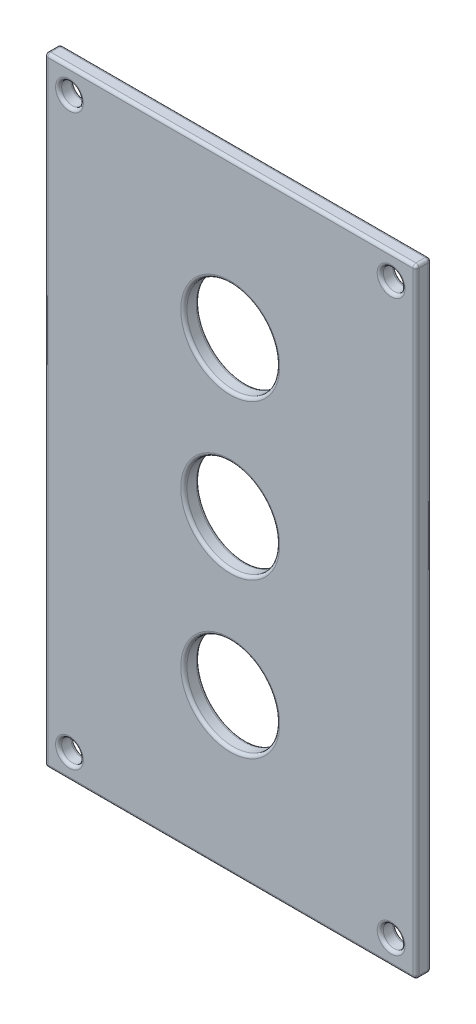
ISO-10303-21;
HEADER;
FILE_DESCRIPTION(('STEP AP214'),'2;1');
FILE_NAME('part.step','',(''),(''),'','','');
FILE_SCHEMA(('AUTOMOTIVE_DESIGN { 1 0 10303 214 1 1 1 1 }'));
ENDSEC;
DATA;
#1=APPLICATION_CONTEXT('core data for automotive mechanical design processes');
#2=APPLICATION_PROTOCOL_DEFINITION('international standard','automotive_design',2000,#1);
#3=PRODUCT_CONTEXT('',#1,'mechanical');
#4=PRODUCT('Part','Part','',(#3));
#5=PRODUCT_RELATED_PRODUCT_CATEGORY('part','',(#4));
#6=PRODUCT_DEFINITION_FORMATION('','',#4);
#7=PRODUCT_DEFINITION_CONTEXT('part definition',#1,'design');
#8=PRODUCT_DEFINITION('design','',#6,#7);
#9=PRODUCT_DEFINITION_SHAPE('','',#8);
#10=(LENGTH_UNIT() NAMED_UNIT(*) SI_UNIT(.MILLI.,.METRE.));
#11=(NAMED_UNIT(*) PLANE_ANGLE_UNIT() SI_UNIT($,.RADIAN.));
#12=(NAMED_UNIT(*) SI_UNIT($,.STERADIAN.) SOLID_ANGLE_UNIT());
#13=UNCERTAINTY_MEASURE_WITH_UNIT(LENGTH_MEASURE(1.E-05),#10,'distance_accuracy_value','');
#14=(GEOMETRIC_REPRESENTATION_CONTEXT(3) GLOBAL_UNCERTAINTY_ASSIGNED_CONTEXT((#13)) GLOBAL_UNIT_ASSIGNED_CONTEXT((#10,
#11,#12)) REPRESENTATION_CONTEXT('',''));
#15=CARTESIAN_POINT('',(0.,0.,0.));
#16=DIRECTION('',(0.,0.,1.));
#17=DIRECTION('',(1.,0.,0.));
#18=AXIS2_PLACEMENT_3D('',#15,#16,#17);
#19=CARTESIAN_POINT('',(0.,0.,2.5));
#20=DIRECTION('',(0.,0.,-1.));
#21=DIRECTION('',(-1.,0.,0.));
#22=AXIS2_PLACEMENT_3D('',#19,#20,#21);
#23=PLANE('',#22);
#24=CARTESIAN_POINT('',(56.,96.,2.5));
#25=DIRECTION('',(0.,0.,-1.));
#26=DIRECTION('',(-1.,0.,0.));
#27=AXIS2_PLACEMENT_3D('',#24,#25,#26);
#28=CIRCLE('',#27,2.25);
#29=CARTESIAN_POINT('',(53.75,96.,2.5));
#30=VERTEX_POINT('',#29);
#31=EDGE_CURVE('E172',#30,#30,#28,.T.);
#32=ORIENTED_EDGE('',*,*,#31,.T.);
#33=EDGE_LOOP('',(#32));
#34=FACE_BOUND('',#33,.T.);
#35=CARTESIAN_POINT('',(56.,4.,2.5));
#36=DIRECTION('',(0.,0.,-1.));
#37=DIRECTION('',(-1.,0.,0.));
#38=AXIS2_PLACEMENT_3D('',#35,#36,#37);
#39=CIRCLE('',#38,2.25);
#40=CARTESIAN_POINT('',(53.75,4.,2.5));
#41=VERTEX_POINT('',#40);
#42=EDGE_CURVE('E169',#41,#41,#39,.T.);
#43=ORIENTED_EDGE('',*,*,#42,.T.);
#44=EDGE_LOOP('',(#43));
#45=FACE_BOUND('',#44,.T.);
#46=CARTESIAN_POINT('',(4.,4.,2.5));
#47=DIRECTION('',(0.,0.,-1.));
#48=DIRECTION('',(-1.,0.,0.));
#49=AXIS2_PLACEMENT_3D('',#46,#47,#48);
#50=CIRCLE('',#49,2.25);
#51=CARTESIAN_POINT('',(1.75,4.,2.5));
#52=VERTEX_POINT('',#51);
#53=EDGE_CURVE('E162',#52,#52,#50,.T.);
#54=ORIENTED_EDGE('',*,*,#53,.T.);
#55=EDGE_LOOP('',(#54));
#56=FACE_BOUND('',#55,.T.);
#57=CARTESIAN_POINT('',(4.,96.,2.5));
#58=DIRECTION('',(0.,0.,-1.));
#59=DIRECTION('',(-1.,0.,0.));
#60=AXIS2_PLACEMENT_3D('',#57,#58,#59);
#61=CIRCLE('',#60,2.25);
#62=CARTESIAN_POINT('',(1.75,96.,2.5));
#63=VERTEX_POINT('',#62);
#64=EDGE_CURVE('E159',#63,#63,#61,.T.);
#65=ORIENTED_EDGE('',*,*,#64,.T.);
#66=EDGE_LOOP('',(#65));
#67=FACE_BOUND('',#66,.T.);
#68=DIRECTION('',(0.,1.,0.));
#69=VECTOR('',#68,1.);
#70=CARTESIAN_POINT('',(59.5,0.,2.5));
#71=LINE('',#70,#69);
#72=CARTESIAN_POINT('',(59.5,0.5,2.5));
#73=VERTEX_POINT('',#72);
#74=CARTESIAN_POINT('',(59.5,99.5,2.5));
#75=VERTEX_POINT('',#74);
#76=EDGE_CURVE('E157',#73,#75,#71,.T.);
#77=ORIENTED_EDGE('',*,*,#76,.T.);
#78=DIRECTION('',(-1.,0.,0.));
#79=VECTOR('',#78,1.);
#80=CARTESIAN_POINT('',(0.,99.5,2.5));
#81=LINE('',#80,#79);
#82=CARTESIAN_POINT('',(0.5,99.5,2.5));
#83=VERTEX_POINT('',#82);
#84=EDGE_CURVE('E128',#75,#83,#81,.T.);
#85=ORIENTED_EDGE('',*,*,#84,.T.);
#86=DIRECTION('',(0.,-1.,0.));
#87=VECTOR('',#86,1.);
#88=CARTESIAN_POINT('',(0.5,0.,2.5));
#89=LINE('',#88,#87);
#90=CARTESIAN_POINT('',(0.5,0.5,2.5));
#91=VERTEX_POINT('',#90);
#92=EDGE_CURVE('E146',#83,#91,#89,.T.);
#93=ORIENTED_EDGE('',*,*,#92,.T.);
#94=DIRECTION('',(1.,0.,0.));
#95=VECTOR('',#94,1.);
#96=CARTESIAN_POINT('',(0.,0.5,2.5));
#97=LINE('',#96,#95);
#98=EDGE_CURVE('E152',#91,#73,#97,.T.);
#99=ORIENTED_EDGE('',*,*,#98,.T.);
#100=EDGE_LOOP('',(#77,#85,#93,#99));
#101=FACE_BOUND('',#100,.T.);
#102=CARTESIAN_POINT('',(30.,50.,2.5));
#103=DIRECTION('',(0.,0.,-1.));
#104=DIRECTION('',(-1.,0.,0.));
#105=AXIS2_PLACEMENT_3D('',#102,#103,#104);
#106=CIRCLE('',#105,8.);
#107=CARTESIAN_POINT('',(22.,50.,2.5));
#108=VERTEX_POINT('',#107);
#109=EDGE_CURVE('E153',#108,#108,#106,.T.);
#110=ORIENTED_EDGE('',*,*,#109,.T.);
#111=EDGE_LOOP('',(#110));
#112=FACE_BOUND('',#111,.T.);
#113=CARTESIAN_POINT('',(30.,75.,2.5));
#114=DIRECTION('',(0.,0.,-1.));
#115=DIRECTION('',(-1.,0.,0.));
#116=AXIS2_PLACEMENT_3D('',#113,#114,#115);
#117=CIRCLE('',#116,8.);
#118=CARTESIAN_POINT('',(22.,75.,2.5));
#119=VERTEX_POINT('',#118);
#120=EDGE_CURVE('E341',#119,#119,#117,.T.);
#121=ORIENTED_EDGE('',*,*,#120,.T.);
#122=EDGE_LOOP('',(#121));
#123=FACE_BOUND('',#122,.T.);
#124=CARTESIAN_POINT('',(30.,25.,2.5));
#125=DIRECTION('',(0.,0.,-1.));
#126=DIRECTION('',(-1.,0.,0.));
#127=AXIS2_PLACEMENT_3D('',#124,#125,#126);
#128=CIRCLE('',#127,8.);
#129=CARTESIAN_POINT('',(22.,25.,2.5));
#130=VERTEX_POINT('',#129);
#131=EDGE_CURVE('E336',#130,#130,#128,.T.);
#132=ORIENTED_EDGE('',*,*,#131,.T.);
#133=EDGE_LOOP('',(#132));
#134=FACE_BOUND('',#133,.T.);
#135=ADVANCED_FACE('F33',(#34,#45,#56,#67,#101,#112,#123,#134),#23,.F.);
#136=CARTESIAN_POINT('',(0.,0.,0.));
#137=DIRECTION('',(0.,0.,-1.));
#138=DIRECTION('',(-1.,0.,0.));
#139=AXIS2_PLACEMENT_3D('',#136,#137,#138);
#140=PLANE('',#139);
#141=CARTESIAN_POINT('',(56.,96.,0.));
#142=DIRECTION('',(0.,0.,-1.));
#143=DIRECTION('',(-1.,0.,0.));
#144=AXIS2_PLACEMENT_3D('',#141,#142,#143);
#145=CIRCLE('',#144,2.25);
#146=CARTESIAN_POINT('',(53.75,96.,0.));
#147=VERTEX_POINT('',#146);
#148=EDGE_CURVE('E11',#147,#147,#145,.F.);
#149=ORIENTED_EDGE('',*,*,#148,.T.);
#150=EDGE_LOOP('',(#149));
#151=FACE_BOUND('',#150,.T.);
#152=CARTESIAN_POINT('',(4.,4.,0.));
#153=DIRECTION('',(0.,0.,-1.));
#154=DIRECTION('',(-1.,0.,0.));
#155=AXIS2_PLACEMENT_3D('',#152,#153,#154);
#156=CIRCLE('',#155,2.25);
#157=CARTESIAN_POINT('',(1.75,4.,0.));
#158=VERTEX_POINT('',#157);
#159=EDGE_CURVE('E42',#158,#158,#156,.F.);
#160=ORIENTED_EDGE('',*,*,#159,.T.);
#161=EDGE_LOOP('',(#160));
#162=FACE_BOUND('',#161,.T.);
#163=DIRECTION('',(0.,1.,0.));
#164=VECTOR('',#163,1.);
#165=CARTESIAN_POINT('',(59.5,0.,0.));
#166=LINE('',#165,#164);
#167=CARTESIAN_POINT('',(59.5,99.5,0.));
#168=VERTEX_POINT('',#167);
#169=CARTESIAN_POINT('',(59.5,0.5,0.));
#170=VERTEX_POINT('',#169);
#171=EDGE_CURVE('E50',#168,#170,#166,.F.);
#172=ORIENTED_EDGE('',*,*,#171,.T.);
#173=DIRECTION('',(1.,0.,0.));
#174=VECTOR('',#173,1.);
#175=CARTESIAN_POINT('',(0.,0.5,0.));
#176=LINE('',#175,#174);
#177=CARTESIAN_POINT('',(0.5,0.5,0.));
#178=VERTEX_POINT('',#177);
#179=EDGE_CURVE('E264',#170,#178,#176,.F.);
#180=ORIENTED_EDGE('',*,*,#179,.T.);
#181=DIRECTION('',(0.,-1.,0.));
#182=VECTOR('',#181,1.);
#183=CARTESIAN_POINT('',(0.5,100.,0.));
#184=LINE('',#183,#182);
#185=CARTESIAN_POINT('',(0.5,99.5,0.));
#186=VERTEX_POINT('',#185);
#187=EDGE_CURVE('E260',#178,#186,#184,.F.);
#188=ORIENTED_EDGE('',*,*,#187,.T.);
#189=DIRECTION('',(-1.,0.,0.));
#190=VECTOR('',#189,1.);
#191=CARTESIAN_POINT('',(60.,99.5,0.));
#192=LINE('',#191,#190);
#193=EDGE_CURVE('E55',#186,#168,#192,.F.);
#194=ORIENTED_EDGE('',*,*,#193,.T.);
#195=EDGE_LOOP('',(#172,#180,#188,#194));
#196=FACE_BOUND('',#195,.T.);
#197=CARTESIAN_POINT('',(4.,96.,0.));
#198=DIRECTION('',(0.,0.,-1.));
#199=DIRECTION('',(-1.,0.,0.));
#200=AXIS2_PLACEMENT_3D('',#197,#198,#199);
#201=CIRCLE('',#200,2.25);
#202=CARTESIAN_POINT('',(1.75,96.,0.));
#203=VERTEX_POINT('',#202);
#204=EDGE_CURVE('E257',#203,#203,#201,.F.);
#205=ORIENTED_EDGE('',*,*,#204,.T.);
#206=EDGE_LOOP('',(#205));
#207=FACE_BOUND('',#206,.T.);
#208=CARTESIAN_POINT('',(56.,4.,0.));
#209=DIRECTION('',(0.,0.,-1.));
#210=DIRECTION('',(-1.,0.,0.));
#211=AXIS2_PLACEMENT_3D('',#208,#209,#210);
#212=CIRCLE('',#211,2.25);
#213=CARTESIAN_POINT('',(53.75,4.,0.));
#214=VERTEX_POINT('',#213);
#215=EDGE_CURVE('E254',#214,#214,#212,.F.);
#216=ORIENTED_EDGE('',*,*,#215,.T.);
#217=EDGE_LOOP('',(#216));
#218=FACE_BOUND('',#217,.T.);
#219=CARTESIAN_POINT('',(30.,50.,0.));
#220=DIRECTION('',(0.,0.,-1.));
#221=DIRECTION('',(-1.,0.,0.));
#222=AXIS2_PLACEMENT_3D('',#219,#220,#221);
#223=CIRCLE('',#222,8.);
#224=CARTESIAN_POINT('',(22.,50.,0.));
#225=VERTEX_POINT('',#224);
#226=EDGE_CURVE('E251',#225,#225,#223,.F.);
#227=ORIENTED_EDGE('',*,*,#226,.T.);
#228=EDGE_LOOP('',(#227));
#229=FACE_BOUND('',#228,.T.);
#230=CARTESIAN_POINT('',(30.,75.,0.));
#231=DIRECTION('',(0.,0.,-1.));
#232=DIRECTION('',(-1.,0.,0.));
#233=AXIS2_PLACEMENT_3D('',#230,#231,#232);
#234=CIRCLE('',#233,8.);
#235=CARTESIAN_POINT('',(22.,75.,0.));
#236=VERTEX_POINT('',#235);
#237=EDGE_CURVE('E248',#236,#236,#234,.F.);
#238=ORIENTED_EDGE('',*,*,#237,.T.);
#239=EDGE_LOOP('',(#238));
#240=FACE_BOUND('',#239,.T.);
#241=CARTESIAN_POINT('',(30.,25.,0.));
#242=DIRECTION('',(0.,0.,-1.));
#243=DIRECTION('',(-1.,0.,0.));
#244=AXIS2_PLACEMENT_3D('',#241,#242,#243);
#245=CIRCLE('',#244,8.);
#246=CARTESIAN_POINT('',(22.,25.,0.));
#247=VERTEX_POINT('',#246);
#248=EDGE_CURVE('E245',#247,#247,#245,.F.);
#249=ORIENTED_EDGE('',*,*,#248,.T.);
#250=EDGE_LOOP('',(#249));
#251=FACE_BOUND('',#250,.T.);
#252=ADVANCED_FACE('F397',(#151,#162,#196,#207,#218,#229,#240,#251),#140,.T.);
#253=CARTESIAN_POINT('',(0.,0.,2.5));
#254=DIRECTION('',(1.,0.,0.));
#255=DIRECTION('',(0.,0.,-1.));
#256=AXIS2_PLACEMENT_3D('',#253,#254,#255);
#257=PLANE('',#256);
#258=DIRECTION('',(0.,-1.,0.));
#259=VECTOR('',#258,1.);
#260=CARTESIAN_POINT('',(0.,0.,2.));
#261=LINE('',#260,#259);
#262=CARTESIAN_POINT('',(0.,0.5,2.));
#263=VERTEX_POINT('',#262);
#264=CARTESIAN_POINT('',(0.,99.5,2.));
#265=VERTEX_POINT('',#264);
#266=EDGE_CURVE('E222',#263,#265,#261,.F.);
#267=ORIENTED_EDGE('',*,*,#266,.T.);
#268=DIRECTION('',(0.,0.,-1.));
#269=VECTOR('',#268,1.);
#270=CARTESIAN_POINT('',(0.,99.5,2.5));
#271=LINE('',#270,#269);
#272=CARTESIAN_POINT('',(0.,99.5,0.5));
#273=VERTEX_POINT('',#272);
#274=EDGE_CURVE('E225',#265,#273,#271,.T.);
#275=ORIENTED_EDGE('',*,*,#274,.T.);
#276=DIRECTION('',(0.,-1.,0.));
#277=VECTOR('',#276,1.);
#278=CARTESIAN_POINT('',(0.,0.,0.5));
#279=LINE('',#278,#277);
#280=CARTESIAN_POINT('',(0.,0.5,0.5));
#281=VERTEX_POINT('',#280);
#282=EDGE_CURVE('E220',#273,#281,#279,.T.);
#283=ORIENTED_EDGE('',*,*,#282,.T.);
#284=DIRECTION('',(0.,0.,-1.));
#285=VECTOR('',#284,1.);
#286=CARTESIAN_POINT('',(0.,0.5,2.5));
#287=LINE('',#286,#285);
#288=EDGE_CURVE('E218',#281,#263,#287,.F.);
#289=ORIENTED_EDGE('',*,*,#288,.T.);
#290=EDGE_LOOP('',(#267,#275,#283,#289));
#291=FACE_BOUND('',#290,.T.);
#292=ADVANCED_FACE('F377',(#291),#257,.F.);
#293=CARTESIAN_POINT('',(0.,0.,2.5));
#294=DIRECTION('',(0.,1.,0.));
#295=DIRECTION('',(0.,0.,1.));
#296=AXIS2_PLACEMENT_3D('',#293,#294,#295);
#297=PLANE('',#296);
#298=DIRECTION('',(1.,0.,0.));
#299=VECTOR('',#298,1.);
#300=CARTESIAN_POINT('',(0.,0.,2.));
#301=LINE('',#300,#299);
#302=CARTESIAN_POINT('',(59.5,0.,2.));
#303=VERTEX_POINT('',#302);
#304=CARTESIAN_POINT('',(0.5,0.,2.));
#305=VERTEX_POINT('',#304);
#306=EDGE_CURVE('E213',#303,#305,#301,.F.);
#307=ORIENTED_EDGE('',*,*,#306,.T.);
#308=DIRECTION('',(0.,0.,-1.));
#309=VECTOR('',#308,1.);
#310=CARTESIAN_POINT('',(0.5,0.,2.5));
#311=LINE('',#310,#309);
#312=CARTESIAN_POINT('',(0.5,0.,0.5));
#313=VERTEX_POINT('',#312);
#314=EDGE_CURVE('E216',#305,#313,#311,.T.);
#315=ORIENTED_EDGE('',*,*,#314,.T.);
#316=DIRECTION('',(1.,0.,0.));
#317=VECTOR('',#316,1.);
#318=CARTESIAN_POINT('',(60.,0.,0.5));
#319=LINE('',#318,#317);
#320=CARTESIAN_POINT('',(59.5,0.,0.5));
#321=VERTEX_POINT('',#320);
#322=EDGE_CURVE('E211',#313,#321,#319,.T.);
#323=ORIENTED_EDGE('',*,*,#322,.T.);
#324=DIRECTION('',(0.,0.,-1.));
#325=VECTOR('',#324,1.);
#326=CARTESIAN_POINT('',(59.5,0.,2.5));
#327=LINE('',#326,#325);
#328=EDGE_CURVE('E209',#321,#303,#327,.F.);
#329=ORIENTED_EDGE('',*,*,#328,.T.);
#330=EDGE_LOOP('',(#307,#315,#323,#329));
#331=FACE_BOUND('',#330,.T.);
#332=ADVANCED_FACE('F415',(#331),#297,.F.);
#333=CARTESIAN_POINT('',(60.,0.,2.5));
#334=DIRECTION('',(-1.,0.,0.));
#335=DIRECTION('',(0.,0.,1.));
#336=AXIS2_PLACEMENT_3D('',#333,#334,#335);
#337=PLANE('',#336);
#338=DIRECTION('',(0.,1.,0.));
#339=VECTOR('',#338,1.);
#340=CARTESIAN_POINT('',(60.,100.,0.5));
#341=LINE('',#340,#339);
#342=CARTESIAN_POINT('',(60.,0.5,0.5));
#343=VERTEX_POINT('',#342);
#344=CARTESIAN_POINT('',(60.,99.5,0.5));
#345=VERTEX_POINT('',#344);
#346=EDGE_CURVE('E202',#343,#345,#341,.T.);
#347=ORIENTED_EDGE('',*,*,#346,.T.);
#348=DIRECTION('',(0.,0.,-1.));
#349=VECTOR('',#348,1.);
#350=CARTESIAN_POINT('',(60.,99.5,2.5));
#351=LINE('',#350,#349);
#352=CARTESIAN_POINT('',(60.,99.5,2.));
#353=VERTEX_POINT('',#352);
#354=EDGE_CURVE('E207',#345,#353,#351,.F.);
#355=ORIENTED_EDGE('',*,*,#354,.T.);
#356=DIRECTION('',(0.,1.,0.));
#357=VECTOR('',#356,1.);
#358=CARTESIAN_POINT('',(60.,0.,2.));
#359=LINE('',#358,#357);
#360=CARTESIAN_POINT('',(60.,0.5,2.));
#361=VERTEX_POINT('',#360);
#362=EDGE_CURVE('E204',#353,#361,#359,.F.);
#363=ORIENTED_EDGE('',*,*,#362,.T.);
#364=DIRECTION('',(0.,0.,-1.));
#365=VECTOR('',#364,1.);
#366=CARTESIAN_POINT('',(60.,0.5,2.5));
#367=LINE('',#366,#365);
#368=EDGE_CURVE('E200',#361,#343,#367,.T.);
#369=ORIENTED_EDGE('',*,*,#368,.T.);
#370=EDGE_LOOP('',(#347,#355,#363,#369));
#371=FACE_BOUND('',#370,.T.);
#372=ADVANCED_FACE('F412',(#371),#337,.F.);
#373=CARTESIAN_POINT('',(0.,100.,2.5));
#374=DIRECTION('',(0.,-1.,0.));
#375=DIRECTION('',(0.,0.,-1.));
#376=AXIS2_PLACEMENT_3D('',#373,#374,#375);
#377=PLANE('',#376);
#378=DIRECTION('',(-1.,0.,0.));
#379=VECTOR('',#378,1.);
#380=CARTESIAN_POINT('',(0.,100.,2.));
#381=LINE('',#380,#379);
#382=CARTESIAN_POINT('',(0.5,100.,2.));
#383=VERTEX_POINT('',#382);
#384=CARTESIAN_POINT('',(59.5,100.,2.));
#385=VERTEX_POINT('',#384);
#386=EDGE_CURVE('E130',#383,#385,#381,.F.);
#387=ORIENTED_EDGE('',*,*,#386,.T.);
#388=DIRECTION('',(0.,0.,-1.));
#389=VECTOR('',#388,1.);
#390=CARTESIAN_POINT('',(59.5,100.,2.5));
#391=LINE('',#390,#389);
#392=CARTESIAN_POINT('',(59.5,100.,0.5));
#393=VERTEX_POINT('',#392);
#394=EDGE_CURVE('E198',#385,#393,#391,.T.);
#395=ORIENTED_EDGE('',*,*,#394,.T.);
#396=DIRECTION('',(-1.,0.,0.));
#397=VECTOR('',#396,1.);
#398=CARTESIAN_POINT('',(0.,100.,0.5));
#399=LINE('',#398,#397);
#400=CARTESIAN_POINT('',(0.5,100.,0.5));
#401=VERTEX_POINT('',#400);
#402=EDGE_CURVE('E195',#393,#401,#399,.T.);
#403=ORIENTED_EDGE('',*,*,#402,.T.);
#404=DIRECTION('',(0.,0.,-1.));
#405=VECTOR('',#404,1.);
#406=CARTESIAN_POINT('',(0.5,100.,2.5));
#407=LINE('',#406,#405);
#408=EDGE_CURVE('E193',#401,#383,#407,.F.);
#409=ORIENTED_EDGE('',*,*,#408,.T.);
#410=EDGE_LOOP('',(#387,#395,#403,#409));
#411=FACE_BOUND('',#410,.T.);
#412=ADVANCED_FACE('F369',(#411),#377,.F.);
#413=CARTESIAN_POINT('',(4.,96.,2.5));
#414=DIRECTION('',(0.,0.,-1.));
#415=DIRECTION('',(-1.,0.,0.));
#416=AXIS2_PLACEMENT_3D('',#413,#414,#415);
#417=CYLINDRICAL_SURFACE('',#416,1.75);
#418=CARTESIAN_POINT('',(4.,96.,2.));
#419=DIRECTION('',(0.,0.,-1.));
#420=DIRECTION('',(-1.,0.,0.));
#421=AXIS2_PLACEMENT_3D('',#418,#419,#420);
#422=CIRCLE('',#421,1.75);
#423=CARTESIAN_POINT('',(2.25,96.,2.));
#424=VERTEX_POINT('',#423);
#425=EDGE_CURVE('E190',#424,#424,#422,.F.);
#426=ORIENTED_EDGE('',*,*,#425,.T.);
#427=EDGE_LOOP('',(#426));
#428=FACE_BOUND('',#427,.T.);
#429=CARTESIAN_POINT('',(4.,96.,0.5));
#430=DIRECTION('',(0.,0.,-1.));
#431=DIRECTION('',(-1.,0.,0.));
#432=AXIS2_PLACEMENT_3D('',#429,#430,#431);
#433=CIRCLE('',#432,1.75);
#434=CARTESIAN_POINT('',(2.25,96.,0.5));
#435=VERTEX_POINT('',#434);
#436=EDGE_CURVE('E187',#435,#435,#433,.T.);
#437=ORIENTED_EDGE('',*,*,#436,.T.);
#438=EDGE_LOOP('',(#437));
#439=FACE_BOUND('',#438,.T.);
#440=ADVANCED_FACE('F407',(#428,#439),#417,.F.);
#441=CARTESIAN_POINT('',(4.,4.,2.5));
#442=DIRECTION('',(0.,0.,-1.));
#443=DIRECTION('',(-1.,0.,0.));
#444=AXIS2_PLACEMENT_3D('',#441,#442,#443);
#445=CYLINDRICAL_SURFACE('',#444,1.75);
#446=CARTESIAN_POINT('',(4.,4.,2.));
#447=DIRECTION('',(0.,0.,-1.));
#448=DIRECTION('',(-1.,0.,0.));
#449=AXIS2_PLACEMENT_3D('',#446,#447,#448);
#450=CIRCLE('',#449,1.75);
#451=CARTESIAN_POINT('',(2.25,4.,2.));
#452=VERTEX_POINT('',#451);
#453=EDGE_CURVE('E184',#452,#452,#450,.F.);
#454=ORIENTED_EDGE('',*,*,#453,.T.);
#455=EDGE_LOOP('',(#454));
#456=FACE_BOUND('',#455,.T.);
#457=CARTESIAN_POINT('',(4.,4.,0.5));
#458=DIRECTION('',(0.,0.,-1.));
#459=DIRECTION('',(-1.,0.,0.));
#460=AXIS2_PLACEMENT_3D('',#457,#458,#459);
#461=CIRCLE('',#460,1.75);
#462=CARTESIAN_POINT('',(2.25,4.,0.5));
#463=VERTEX_POINT('',#462);
#464=EDGE_CURVE('E181',#463,#463,#461,.T.);
#465=ORIENTED_EDGE('',*,*,#464,.T.);
#466=EDGE_LOOP('',(#465));
#467=FACE_BOUND('',#466,.T.);
#468=ADVANCED_FACE('F751',(#456,#467),#445,.F.);
#469=CARTESIAN_POINT('',(56.,4.,2.5));
#470=DIRECTION('',(0.,0.,-1.));
#471=DIRECTION('',(-1.,0.,0.));
#472=AXIS2_PLACEMENT_3D('',#469,#470,#471);
#473=CYLINDRICAL_SURFACE('',#472,1.75);
#474=CARTESIAN_POINT('',(56.,4.,2.));
#475=DIRECTION('',(0.,0.,-1.));
#476=DIRECTION('',(-1.,0.,0.));
#477=AXIS2_PLACEMENT_3D('',#474,#475,#476);
#478=CIRCLE('',#477,1.75);
#479=CARTESIAN_POINT('',(54.25,4.,2.));
#480=VERTEX_POINT('',#479);
#481=EDGE_CURVE('E178',#480,#480,#478,.F.);
#482=ORIENTED_EDGE('',*,*,#481,.T.);
#483=EDGE_LOOP('',(#482));
#484=FACE_BOUND('',#483,.T.);
#485=CARTESIAN_POINT('',(56.,4.,0.5));
#486=DIRECTION('',(0.,0.,-1.));
#487=DIRECTION('',(-1.,0.,0.));
#488=AXIS2_PLACEMENT_3D('',#485,#486,#487);
#489=CIRCLE('',#488,1.75);
#490=CARTESIAN_POINT('',(54.25,4.,0.5));
#491=VERTEX_POINT('',#490);
#492=EDGE_CURVE('E175',#491,#491,#489,.T.);
#493=ORIENTED_EDGE('',*,*,#492,.T.);
#494=EDGE_LOOP('',(#493));
#495=FACE_BOUND('',#494,.T.);
#496=ADVANCED_FACE('F742',(#484,#495),#473,.F.);
#497=CARTESIAN_POINT('',(56.,96.,2.5));
#498=DIRECTION('',(0.,0.,-1.));
#499=DIRECTION('',(-1.,0.,0.));
#500=AXIS2_PLACEMENT_3D('',#497,#498,#499);
#501=CYLINDRICAL_SURFACE('',#500,1.75);
#502=CARTESIAN_POINT('',(56.,96.,2.));
#503=DIRECTION('',(0.,0.,-1.));
#504=DIRECTION('',(-1.,0.,0.));
#505=AXIS2_PLACEMENT_3D('',#502,#503,#504);
#506=CIRCLE('',#505,1.75);
#507=CARTESIAN_POINT('',(54.25,96.,2.));
#508=VERTEX_POINT('',#507);
#509=EDGE_CURVE('E331',#508,#508,#506,.F.);
#510=ORIENTED_EDGE('',*,*,#509,.T.);
#511=EDGE_LOOP('',(#510));
#512=FACE_BOUND('',#511,.T.);
#513=CARTESIAN_POINT('',(56.,96.,0.5));
#514=DIRECTION('',(0.,0.,-1.));
#515=DIRECTION('',(-1.,0.,0.));
#516=AXIS2_PLACEMENT_3D('',#513,#514,#515);
#517=CIRCLE('',#516,1.75);
#518=CARTESIAN_POINT('',(54.25,96.,0.5));
#519=VERTEX_POINT('',#518);
#520=EDGE_CURVE('E325',#519,#519,#517,.T.);
#521=ORIENTED_EDGE('',*,*,#520,.T.);
#522=EDGE_LOOP('',(#521));
#523=FACE_BOUND('',#522,.T.);
#524=ADVANCED_FACE('F733',(#512,#523),#501,.F.);
#525=CARTESIAN_POINT('',(30.,50.,-0.00100000000000013));
#526=DIRECTION('',(0.,0.,1.));
#527=DIRECTION('',(1.,0.,0.));
#528=AXIS2_PLACEMENT_3D('',#525,#526,#527);
#529=CYLINDRICAL_SURFACE('',#528,7.5);
#530=CARTESIAN_POINT('',(30.,50.,2.));
#531=DIRECTION('',(0.,0.,-1.));
#532=DIRECTION('',(-1.,0.,0.));
#533=AXIS2_PLACEMENT_3D('',#530,#531,#532);
#534=CIRCLE('',#533,7.5);
#535=CARTESIAN_POINT('',(22.5,50.,2.));
#536=VERTEX_POINT('',#535);
#537=EDGE_CURVE('E230',#536,#536,#534,.F.);
#538=ORIENTED_EDGE('',*,*,#537,.T.);
#539=EDGE_LOOP('',(#538));
#540=FACE_BOUND('',#539,.T.);
#541=CARTESIAN_POINT('',(30.,50.,0.5));
#542=DIRECTION('',(0.,0.,-1.));
#543=DIRECTION('',(-1.,0.,0.));
#544=AXIS2_PLACEMENT_3D('',#541,#542,#543);
#545=CIRCLE('',#544,7.5);
#546=CARTESIAN_POINT('',(22.5,50.,0.5));
#547=VERTEX_POINT('',#546);
#548=EDGE_CURVE('E227',#547,#547,#545,.T.);
#549=ORIENTED_EDGE('',*,*,#548,.T.);
#550=EDGE_LOOP('',(#549));
#551=FACE_BOUND('',#550,.T.);
#552=ADVANCED_FACE('F724',(#540,#551),#529,.F.);
#553=CARTESIAN_POINT('',(30.,75.,-0.00100000000000013));
#554=DIRECTION('',(0.,0.,1.));
#555=DIRECTION('',(1.,0.,0.));
#556=AXIS2_PLACEMENT_3D('',#553,#554,#555);
#557=CYLINDRICAL_SURFACE('',#556,7.5);
#558=CARTESIAN_POINT('',(30.,75.,2.));
#559=DIRECTION('',(0.,0.,-1.));
#560=DIRECTION('',(-1.,0.,0.));
#561=AXIS2_PLACEMENT_3D('',#558,#559,#560);
#562=CIRCLE('',#561,7.5);
#563=CARTESIAN_POINT('',(22.5,75.,2.));
#564=VERTEX_POINT('',#563);
#565=EDGE_CURVE('E236',#564,#564,#562,.F.);
#566=ORIENTED_EDGE('',*,*,#565,.T.);
#567=EDGE_LOOP('',(#566));
#568=FACE_BOUND('',#567,.T.);
#569=CARTESIAN_POINT('',(30.,75.,0.5));
#570=DIRECTION('',(0.,0.,-1.));
#571=DIRECTION('',(-1.,0.,0.));
#572=AXIS2_PLACEMENT_3D('',#569,#570,#571);
#573=CIRCLE('',#572,7.5);
#574=CARTESIAN_POINT('',(22.5,75.,0.5));
#575=VERTEX_POINT('',#574);
#576=EDGE_CURVE('E233',#575,#575,#573,.T.);
#577=ORIENTED_EDGE('',*,*,#576,.T.);
#578=EDGE_LOOP('',(#577));
#579=FACE_BOUND('',#578,.T.);
#580=ADVANCED_FACE('F715',(#568,#579),#557,.F.);
#581=CARTESIAN_POINT('',(30.,25.,-0.00100000000000013));
#582=DIRECTION('',(0.,0.,1.));
#583=DIRECTION('',(1.,0.,0.));
#584=AXIS2_PLACEMENT_3D('',#581,#582,#583);
#585=CYLINDRICAL_SURFACE('',#584,7.5);
#586=CARTESIAN_POINT('',(30.,25.,2.));
#587=DIRECTION('',(0.,0.,-1.));
#588=DIRECTION('',(-1.,0.,0.));
#589=AXIS2_PLACEMENT_3D('',#586,#587,#588);
#590=CIRCLE('',#589,7.5);
#591=CARTESIAN_POINT('',(22.5,25.,2.));
#592=VERTEX_POINT('',#591);
#593=EDGE_CURVE('E242',#592,#592,#590,.F.);
#594=ORIENTED_EDGE('',*,*,#593,.T.);
#595=EDGE_LOOP('',(#594));
#596=FACE_BOUND('',#595,.T.);
#597=CARTESIAN_POINT('',(30.,25.,0.5));
#598=DIRECTION('',(0.,0.,-1.));
#599=DIRECTION('',(-1.,0.,0.));
#600=AXIS2_PLACEMENT_3D('',#597,#598,#599);
#601=CIRCLE('',#600,7.5);
#602=CARTESIAN_POINT('',(22.5,25.,0.5));
#603=VERTEX_POINT('',#602);
#604=EDGE_CURVE('E239',#603,#603,#601,.T.);
#605=ORIENTED_EDGE('',*,*,#604,.T.);
#606=EDGE_LOOP('',(#605));
#607=FACE_BOUND('',#606,.T.);
#608=ADVANCED_FACE('F426',(#596,#607),#585,.F.);
#609=CARTESIAN_POINT('',(56.,96.,2.));
#610=DIRECTION('',(0.,0.,-1.));
#611=DIRECTION('',(-1.,0.,0.));
#612=AXIS2_PLACEMENT_3D('',#609,#610,#611);
#613=TOROIDAL_SURFACE('',#612,2.25,0.5);
#614=ORIENTED_EDGE('',*,*,#31,.F.);
#615=EDGE_LOOP('',(#614));
#616=FACE_BOUND('',#615,.T.);
#617=ORIENTED_EDGE('',*,*,#509,.F.);
#618=EDGE_LOOP('',(#617));
#619=FACE_BOUND('',#618,.T.);
#620=ADVANCED_FACE('F422',(#616,#619),#613,.T.);
#621=CARTESIAN_POINT('',(56.,4.,2.));
#622=DIRECTION('',(0.,0.,-1.));
#623=DIRECTION('',(-1.,0.,0.));
#624=AXIS2_PLACEMENT_3D('',#621,#622,#623);
#625=TOROIDAL_SURFACE('',#624,2.25,0.5);
#626=ORIENTED_EDGE('',*,*,#42,.F.);
#627=EDGE_LOOP('',(#626));
#628=FACE_BOUND('',#627,.T.);
#629=ORIENTED_EDGE('',*,*,#481,.F.);
#630=EDGE_LOOP('',(#629));
#631=FACE_BOUND('',#630,.T.);
#632=ADVANCED_FACE('F425',(#628,#631),#625,.T.);
#633=CARTESIAN_POINT('',(4.,4.,2.));
#634=DIRECTION('',(0.,0.,-1.));
#635=DIRECTION('',(-1.,0.,0.));
#636=AXIS2_PLACEMENT_3D('',#633,#634,#635);
#637=TOROIDAL_SURFACE('',#636,2.25,0.5);
#638=ORIENTED_EDGE('',*,*,#53,.F.);
#639=EDGE_LOOP('',(#638));
#640=FACE_BOUND('',#639,.T.);
#641=ORIENTED_EDGE('',*,*,#453,.F.);
#642=EDGE_LOOP('',(#641));
#643=FACE_BOUND('',#642,.T.);
#644=ADVANCED_FACE('F430',(#640,#643),#637,.T.);
#645=CARTESIAN_POINT('',(4.,96.,2.));
#646=DIRECTION('',(0.,0.,-1.));
#647=DIRECTION('',(-1.,0.,0.));
#648=AXIS2_PLACEMENT_3D('',#645,#646,#647);
#649=TOROIDAL_SURFACE('',#648,2.25,0.5);
#650=ORIENTED_EDGE('',*,*,#64,.F.);
#651=EDGE_LOOP('',(#650));
#652=FACE_BOUND('',#651,.T.);
#653=ORIENTED_EDGE('',*,*,#425,.F.);
#654=EDGE_LOOP('',(#653));
#655=FACE_BOUND('',#654,.T.);
#656=ADVANCED_FACE('F434',(#652,#655),#649,.T.);
#657=CARTESIAN_POINT('',(0.,0.5,0.5));
#658=DIRECTION('',(-1.,0.,0.));
#659=DIRECTION('',(0.,0.,1.));
#660=AXIS2_PLACEMENT_3D('',#657,#658,#659);
#661=CYLINDRICAL_SURFACE('',#660,0.5);
#662=CARTESIAN_POINT('',(59.5,0.5,0.5));
#663=DIRECTION('',(1.,0.,0.));
#664=DIRECTION('',(0.,0.,-1.));
#665=AXIS2_PLACEMENT_3D('',#662,#663,#664);
#666=CIRCLE('',#665,0.5);
#667=EDGE_CURVE('E37',#321,#170,#666,.T.);
#668=ORIENTED_EDGE('',*,*,#667,.F.);
#669=ORIENTED_EDGE('',*,*,#322,.F.);
#670=CARTESIAN_POINT('',(0.5,0.5,0.5));
#671=DIRECTION('',(-1.,0.,0.));
#672=DIRECTION('',(0.,0.,1.));
#673=AXIS2_PLACEMENT_3D('',#670,#671,#672);
#674=CIRCLE('',#673,0.5);
#675=EDGE_CURVE('E318',#178,#313,#674,.T.);
#676=ORIENTED_EDGE('',*,*,#675,.F.);
#677=ORIENTED_EDGE('',*,*,#179,.F.);
#678=EDGE_LOOP('',(#668,#669,#676,#677));
#679=FACE_BOUND('',#678,.T.);
#680=ADVANCED_FACE('F438',(#679),#661,.T.);
#681=CARTESIAN_POINT('',(59.5,0.5,0.5));
#682=DIRECTION('',(0.,0.,1.));
#683=DIRECTION('',(1.,0.,0.));
#684=AXIS2_PLACEMENT_3D('',#681,#682,#683);
#685=SPHERICAL_SURFACE('',#684,0.5);
#686=CARTESIAN_POINT('',(59.5,0.5,0.5));
#687=DIRECTION('',(0.,0.,-1.));
#688=DIRECTION('',(-1.,0.,0.));
#689=AXIS2_PLACEMENT_3D('',#686,#687,#688);
#690=CIRCLE('',#689,0.5);
#691=EDGE_CURVE('E313',#321,#343,#690,.F.);
#692=ORIENTED_EDGE('',*,*,#691,.F.);
#693=ORIENTED_EDGE('',*,*,#667,.T.);
#694=CARTESIAN_POINT('',(59.5,0.5,0.5));
#695=DIRECTION('',(0.,-1.,0.));
#696=DIRECTION('',(0.,0.,-1.));
#697=AXIS2_PLACEMENT_3D('',#694,#695,#696);
#698=CIRCLE('',#697,0.5);
#699=EDGE_CURVE('E316',#343,#170,#698,.F.);
#700=ORIENTED_EDGE('',*,*,#699,.F.);
#701=EDGE_LOOP('',(#692,#693,#700));
#702=FACE_BOUND('',#701,.T.);
#703=ADVANCED_FACE('F672',(#702),#685,.T.);
#704=CARTESIAN_POINT('',(0.5,0.5,0.5));
#705=DIRECTION('',(0.,0.,1.));
#706=DIRECTION('',(1.,0.,0.));
#707=AXIS2_PLACEMENT_3D('',#704,#705,#706);
#708=SPHERICAL_SURFACE('',#707,0.5);
#709=CARTESIAN_POINT('',(0.5,0.5,0.5));
#710=DIRECTION('',(0.,-1.,0.));
#711=DIRECTION('',(0.,0.,-1.));
#712=AXIS2_PLACEMENT_3D('',#709,#710,#711);
#713=CIRCLE('',#712,0.5);
#714=EDGE_CURVE('E307',#178,#281,#713,.F.);
#715=ORIENTED_EDGE('',*,*,#714,.F.);
#716=ORIENTED_EDGE('',*,*,#675,.T.);
#717=CARTESIAN_POINT('',(0.5,0.5,0.5));
#718=DIRECTION('',(0.,0.,-1.));
#719=DIRECTION('',(-1.,0.,0.));
#720=AXIS2_PLACEMENT_3D('',#717,#718,#719);
#721=CIRCLE('',#720,0.5);
#722=EDGE_CURVE('E310',#281,#313,#721,.F.);
#723=ORIENTED_EDGE('',*,*,#722,.F.);
#724=EDGE_LOOP('',(#715,#716,#723));
#725=FACE_BOUND('',#724,.T.);
#726=ADVANCED_FACE('F663',(#725),#708,.T.);
#727=CARTESIAN_POINT('',(59.5,0.,0.5));
#728=DIRECTION('',(0.,-1.,0.));
#729=DIRECTION('',(0.,0.,-1.));
#730=AXIS2_PLACEMENT_3D('',#727,#728,#729);
#731=CYLINDRICAL_SURFACE('',#730,0.5);
#732=ORIENTED_EDGE('',*,*,#699,.T.);
#733=ORIENTED_EDGE('',*,*,#171,.F.);
#734=CARTESIAN_POINT('',(59.5,99.5,0.5));
#735=DIRECTION('',(0.,1.,0.));
#736=DIRECTION('',(0.,0.,1.));
#737=AXIS2_PLACEMENT_3D('',#734,#735,#736);
#738=CIRCLE('',#737,0.5);
#739=EDGE_CURVE('E301',#345,#168,#738,.T.);
#740=ORIENTED_EDGE('',*,*,#739,.F.);
#741=ORIENTED_EDGE('',*,*,#346,.F.);
#742=EDGE_LOOP('',(#732,#733,#740,#741));
#743=FACE_BOUND('',#742,.T.);
#744=ADVANCED_FACE('F654',(#743),#731,.T.);
#745=CARTESIAN_POINT('',(59.5,0.5,2.5));
#746=DIRECTION('',(0.,0.,-1.));
#747=DIRECTION('',(-1.,0.,0.));
#748=AXIS2_PLACEMENT_3D('',#745,#746,#747);
#749=CYLINDRICAL_SURFACE('',#748,0.5);
#750=ORIENTED_EDGE('',*,*,#691,.T.);
#751=ORIENTED_EDGE('',*,*,#368,.F.);
#752=CARTESIAN_POINT('',(59.5,0.5,2.));
#753=DIRECTION('',(0.,0.,1.));
#754=DIRECTION('',(1.,0.,0.));
#755=AXIS2_PLACEMENT_3D('',#752,#753,#754);
#756=CIRCLE('',#755,0.5);
#757=EDGE_CURVE('E298',#303,#361,#756,.T.);
#758=ORIENTED_EDGE('',*,*,#757,.F.);
#759=ORIENTED_EDGE('',*,*,#328,.F.);
#760=EDGE_LOOP('',(#750,#751,#758,#759));
#761=FACE_BOUND('',#760,.T.);
#762=ADVANCED_FACE('F646',(#761),#749,.T.);
#763=CARTESIAN_POINT('',(0.,0.5,2.));
#764=DIRECTION('',(1.,0.,0.));
#765=DIRECTION('',(0.,0.,-1.));
#766=AXIS2_PLACEMENT_3D('',#763,#764,#765);
#767=CYLINDRICAL_SURFACE('',#766,0.5);
#768=CARTESIAN_POINT('',(0.5,0.5,2.));
#769=DIRECTION('',(-1.,0.,0.));
#770=DIRECTION('',(0.,0.,1.));
#771=AXIS2_PLACEMENT_3D('',#768,#769,#770);
#772=CIRCLE('',#771,0.5);
#773=EDGE_CURVE('E292',#305,#91,#772,.T.);
#774=ORIENTED_EDGE('',*,*,#773,.F.);
#775=ORIENTED_EDGE('',*,*,#306,.F.);
#776=CARTESIAN_POINT('',(59.5,0.5,2.));
#777=DIRECTION('',(1.,0.,0.));
#778=DIRECTION('',(0.,0.,-1.));
#779=AXIS2_PLACEMENT_3D('',#776,#777,#778);
#780=CIRCLE('',#779,0.5);
#781=EDGE_CURVE('E295',#73,#303,#780,.T.);
#782=ORIENTED_EDGE('',*,*,#781,.F.);
#783=ORIENTED_EDGE('',*,*,#98,.F.);
#784=EDGE_LOOP('',(#774,#775,#782,#783));
#785=FACE_BOUND('',#784,.T.);
#786=ADVANCED_FACE('F350',(#785),#767,.T.);
#787=CARTESIAN_POINT('',(0.5,0.5,2.5));
#788=DIRECTION('',(0.,0.,-1.));
#789=DIRECTION('',(-1.,0.,0.));
#790=AXIS2_PLACEMENT_3D('',#787,#788,#789);
#791=CYLINDRICAL_SURFACE('',#790,0.5);
#792=ORIENTED_EDGE('',*,*,#722,.T.);
#793=ORIENTED_EDGE('',*,*,#314,.F.);
#794=CARTESIAN_POINT('',(0.5,0.5,2.));
#795=DIRECTION('',(0.,0.,1.));
#796=DIRECTION('',(1.,0.,0.));
#797=AXIS2_PLACEMENT_3D('',#794,#795,#796);
#798=CIRCLE('',#797,0.5);
#799=EDGE_CURVE('E290',#263,#305,#798,.T.);
#800=ORIENTED_EDGE('',*,*,#799,.F.);
#801=ORIENTED_EDGE('',*,*,#288,.F.);
#802=EDGE_LOOP('',(#792,#793,#800,#801));
#803=FACE_BOUND('',#802,.T.);
#804=ADVANCED_FACE('F382',(#803),#791,.T.);
#805=CARTESIAN_POINT('',(0.5,0.,0.5));
#806=DIRECTION('',(0.,1.,0.));
#807=DIRECTION('',(0.,0.,1.));
#808=AXIS2_PLACEMENT_3D('',#805,#806,#807);
#809=CYLINDRICAL_SURFACE('',#808,0.5);
#810=ORIENTED_EDGE('',*,*,#714,.T.);
#811=ORIENTED_EDGE('',*,*,#282,.F.);
#812=CARTESIAN_POINT('',(0.5,99.5,0.5));
#813=DIRECTION('',(0.,1.,0.));
#814=DIRECTION('',(0.,0.,1.));
#815=AXIS2_PLACEMENT_3D('',#812,#813,#814);
#816=CIRCLE('',#815,0.5);
#817=EDGE_CURVE('E287',#186,#273,#816,.T.);
#818=ORIENTED_EDGE('',*,*,#817,.F.);
#819=ORIENTED_EDGE('',*,*,#187,.F.);
#820=EDGE_LOOP('',(#810,#811,#818,#819));
#821=FACE_BOUND('',#820,.T.);
#822=ADVANCED_FACE('F622',(#821),#809,.T.);
#823=CARTESIAN_POINT('',(0.,99.5,0.5));
#824=DIRECTION('',(1.,0.,0.));
#825=DIRECTION('',(0.,0.,-1.));
#826=AXIS2_PLACEMENT_3D('',#823,#824,#825);
#827=CYLINDRICAL_SURFACE('',#826,0.5);
#828=CARTESIAN_POINT('',(59.5,99.5,0.5));
#829=DIRECTION('',(1.,0.,0.));
#830=DIRECTION('',(0.,0.,-1.));
#831=AXIS2_PLACEMENT_3D('',#828,#829,#830);
#832=CIRCLE('',#831,0.5);
#833=EDGE_CURVE('E304',#168,#393,#832,.T.);
#834=ORIENTED_EDGE('',*,*,#833,.F.);
#835=ORIENTED_EDGE('',*,*,#193,.F.);
#836=CARTESIAN_POINT('',(0.5,99.5,0.5));
#837=DIRECTION('',(-1.,0.,0.));
#838=DIRECTION('',(0.,0.,1.));
#839=AXIS2_PLACEMENT_3D('',#836,#837,#838);
#840=CIRCLE('',#839,0.5);
#841=EDGE_CURVE('E284',#401,#186,#840,.T.);
#842=ORIENTED_EDGE('',*,*,#841,.F.);
#843=ORIENTED_EDGE('',*,*,#402,.F.);
#844=EDGE_LOOP('',(#834,#835,#842,#843));
#845=FACE_BOUND('',#844,.T.);
#846=ADVANCED_FACE('F613',(#845),#827,.T.);
#847=CARTESIAN_POINT('',(59.5,99.5,0.5));
#848=DIRECTION('',(0.,0.,1.));
#849=DIRECTION('',(1.,0.,0.));
#850=AXIS2_PLACEMENT_3D('',#847,#848,#849);
#851=SPHERICAL_SURFACE('',#850,0.5);
#852=ORIENTED_EDGE('',*,*,#739,.T.);
#853=ORIENTED_EDGE('',*,*,#833,.T.);
#854=CARTESIAN_POINT('',(59.5,99.5,0.5));
#855=DIRECTION('',(0.,0.,-1.));
#856=DIRECTION('',(-1.,0.,0.));
#857=AXIS2_PLACEMENT_3D('',#854,#855,#856);
#858=CIRCLE('',#857,0.5);
#859=EDGE_CURVE('E281',#345,#393,#858,.F.);
#860=ORIENTED_EDGE('',*,*,#859,.F.);
#861=EDGE_LOOP('',(#852,#853,#860));
#862=FACE_BOUND('',#861,.T.);
#863=ADVANCED_FACE('F394',(#862),#851,.T.);
#864=CARTESIAN_POINT('',(59.5,0.5,2.));
#865=DIRECTION('',(0.,0.,1.));
#866=DIRECTION('',(1.,0.,0.));
#867=AXIS2_PLACEMENT_3D('',#864,#865,#866);
#868=SPHERICAL_SURFACE('',#867,0.5);
#869=ORIENTED_EDGE('',*,*,#781,.T.);
#870=ORIENTED_EDGE('',*,*,#757,.T.);
#871=CARTESIAN_POINT('',(59.5,0.5,2.));
#872=DIRECTION('',(0.,-1.,0.));
#873=DIRECTION('',(0.,0.,-1.));
#874=AXIS2_PLACEMENT_3D('',#871,#872,#873);
#875=CIRCLE('',#874,0.5);
#876=EDGE_CURVE('E279',#73,#361,#875,.F.);
#877=ORIENTED_EDGE('',*,*,#876,.F.);
#878=EDGE_LOOP('',(#869,#870,#877));
#879=FACE_BOUND('',#878,.T.);
#880=ADVANCED_FACE('F353',(#879),#868,.T.);
#881=CARTESIAN_POINT('',(0.5,0.5,2.));
#882=DIRECTION('',(0.,0.,1.));
#883=DIRECTION('',(1.,0.,0.));
#884=AXIS2_PLACEMENT_3D('',#881,#882,#883);
#885=SPHERICAL_SURFACE('',#884,0.5);
#886=ORIENTED_EDGE('',*,*,#799,.T.);
#887=ORIENTED_EDGE('',*,*,#773,.T.);
#888=CARTESIAN_POINT('',(0.5,0.5,2.));
#889=DIRECTION('',(0.,-1.,0.));
#890=DIRECTION('',(0.,0.,-1.));
#891=AXIS2_PLACEMENT_3D('',#888,#889,#890);
#892=CIRCLE('',#891,0.5);
#893=EDGE_CURVE('E149',#263,#91,#892,.F.);
#894=ORIENTED_EDGE('',*,*,#893,.F.);
#895=EDGE_LOOP('',(#886,#887,#894));
#896=FACE_BOUND('',#895,.T.);
#897=ADVANCED_FACE('F384',(#896),#885,.T.);
#898=CARTESIAN_POINT('',(0.5,99.5,0.5));
#899=DIRECTION('',(0.,0.,1.));
#900=DIRECTION('',(1.,0.,0.));
#901=AXIS2_PLACEMENT_3D('',#898,#899,#900);
#902=SPHERICAL_SURFACE('',#901,0.5);
#903=ORIENTED_EDGE('',*,*,#841,.T.);
#904=ORIENTED_EDGE('',*,*,#817,.T.);
#905=CARTESIAN_POINT('',(0.5,99.5,0.5));
#906=DIRECTION('',(0.,0.,-1.));
#907=DIRECTION('',(-1.,0.,0.));
#908=AXIS2_PLACEMENT_3D('',#905,#906,#907);
#909=CIRCLE('',#908,0.5);
#910=EDGE_CURVE('E275',#401,#273,#909,.F.);
#911=ORIENTED_EDGE('',*,*,#910,.F.);
#912=EDGE_LOOP('',(#903,#904,#911));
#913=FACE_BOUND('',#912,.T.);
#914=ADVANCED_FACE('F386',(#913),#902,.T.);
#915=CARTESIAN_POINT('',(59.5,99.5,2.5));
#916=DIRECTION('',(0.,0.,-1.));
#917=DIRECTION('',(-1.,0.,0.));
#918=AXIS2_PLACEMENT_3D('',#915,#916,#917);
#919=CYLINDRICAL_SURFACE('',#918,0.5);
#920=ORIENTED_EDGE('',*,*,#859,.T.);
#921=ORIENTED_EDGE('',*,*,#394,.F.);
#922=CARTESIAN_POINT('',(59.5,99.5,2.));
#923=DIRECTION('',(0.,0.,1.));
#924=DIRECTION('',(1.,0.,0.));
#925=AXIS2_PLACEMENT_3D('',#922,#923,#924);
#926=CIRCLE('',#925,0.5);
#927=EDGE_CURVE('E272',#353,#385,#926,.T.);
#928=ORIENTED_EDGE('',*,*,#927,.F.);
#929=ORIENTED_EDGE('',*,*,#354,.F.);
#930=EDGE_LOOP('',(#920,#921,#928,#929));
#931=FACE_BOUND('',#930,.T.);
#932=ADVANCED_FACE('F365',(#931),#919,.T.);
#933=CARTESIAN_POINT('',(59.5,0.,2.));
#934=DIRECTION('',(0.,1.,0.));
#935=DIRECTION('',(0.,0.,1.));
#936=AXIS2_PLACEMENT_3D('',#933,#934,#935);
#937=CYLINDRICAL_SURFACE('',#936,0.5);
#938=ORIENTED_EDGE('',*,*,#876,.T.);
#939=ORIENTED_EDGE('',*,*,#362,.F.);
#940=CARTESIAN_POINT('',(59.5,99.5,2.));
#941=DIRECTION('',(0.,1.,0.));
#942=DIRECTION('',(0.,0.,1.));
#943=AXIS2_PLACEMENT_3D('',#940,#941,#942);
#944=CIRCLE('',#943,0.5);
#945=EDGE_CURVE('E143',#75,#353,#944,.T.);
#946=ORIENTED_EDGE('',*,*,#945,.F.);
#947=ORIENTED_EDGE('',*,*,#76,.F.);
#948=EDGE_LOOP('',(#938,#939,#946,#947));
#949=FACE_BOUND('',#948,.T.);
#950=ADVANCED_FACE('F357',(#949),#937,.T.);
#951=CARTESIAN_POINT('',(0.5,0.,2.));
#952=DIRECTION('',(0.,-1.,0.));
#953=DIRECTION('',(0.,0.,-1.));
#954=AXIS2_PLACEMENT_3D('',#951,#952,#953);
#955=CYLINDRICAL_SURFACE('',#954,0.5);
#956=ORIENTED_EDGE('',*,*,#893,.T.);
#957=ORIENTED_EDGE('',*,*,#92,.F.);
#958=CARTESIAN_POINT('',(0.5,99.5,2.));
#959=DIRECTION('',(0.,1.,0.));
#960=DIRECTION('',(0.,0.,1.));
#961=AXIS2_PLACEMENT_3D('',#958,#959,#960);
#962=CIRCLE('',#961,0.5);
#963=EDGE_CURVE('E135',#265,#83,#962,.T.);
#964=ORIENTED_EDGE('',*,*,#963,.F.);
#965=ORIENTED_EDGE('',*,*,#266,.F.);
#966=EDGE_LOOP('',(#956,#957,#964,#965));
#967=FACE_BOUND('',#966,.T.);
#968=ADVANCED_FACE('F147',(#967),#955,.T.);
#969=CARTESIAN_POINT('',(0.5,99.5,2.5));
#970=DIRECTION('',(0.,0.,-1.));
#971=DIRECTION('',(-1.,0.,0.));
#972=AXIS2_PLACEMENT_3D('',#969,#970,#971);
#973=CYLINDRICAL_SURFACE('',#972,0.5);
#974=ORIENTED_EDGE('',*,*,#910,.T.);
#975=ORIENTED_EDGE('',*,*,#274,.F.);
#976=CARTESIAN_POINT('',(0.5,99.5,2.));
#977=DIRECTION('',(0.,0.,1.));
#978=DIRECTION('',(1.,0.,0.));
#979=AXIS2_PLACEMENT_3D('',#976,#977,#978);
#980=CIRCLE('',#979,0.5);
#981=EDGE_CURVE('E139',#383,#265,#980,.T.);
#982=ORIENTED_EDGE('',*,*,#981,.F.);
#983=ORIENTED_EDGE('',*,*,#408,.F.);
#984=EDGE_LOOP('',(#974,#975,#982,#983));
#985=FACE_BOUND('',#984,.T.);
#986=ADVANCED_FACE('F373',(#985),#973,.T.);
#987=CARTESIAN_POINT('',(59.5,99.5,2.));
#988=DIRECTION('',(0.,0.,1.));
#989=DIRECTION('',(1.,0.,0.));
#990=AXIS2_PLACEMENT_3D('',#987,#988,#989);
#991=SPHERICAL_SURFACE('',#990,0.5);
#992=ORIENTED_EDGE('',*,*,#945,.T.);
#993=ORIENTED_EDGE('',*,*,#927,.T.);
#994=CARTESIAN_POINT('',(59.5,99.5,2.));
#995=DIRECTION('',(1.,0.,0.));
#996=DIRECTION('',(0.,0.,-1.));
#997=AXIS2_PLACEMENT_3D('',#994,#995,#996);
#998=CIRCLE('',#997,0.5);
#999=EDGE_CURVE('E132',#75,#385,#998,.F.);
#1000=ORIENTED_EDGE('',*,*,#999,.F.);
#1001=EDGE_LOOP('',(#992,#993,#1000));
#1002=FACE_BOUND('',#1001,.T.);
#1003=ADVANCED_FACE('F361',(#1002),#991,.T.);
#1004=CARTESIAN_POINT('',(0.5,99.5,2.));
#1005=DIRECTION('',(0.,0.,1.));
#1006=DIRECTION('',(1.,0.,0.));
#1007=AXIS2_PLACEMENT_3D('',#1004,#1005,#1006);
#1008=SPHERICAL_SURFACE('',#1007,0.5);
#1009=ORIENTED_EDGE('',*,*,#981,.T.);
#1010=ORIENTED_EDGE('',*,*,#963,.T.);
#1011=CARTESIAN_POINT('',(0.5,99.5,2.));
#1012=DIRECTION('',(-1.,0.,0.));
#1013=DIRECTION('',(0.,0.,1.));
#1014=AXIS2_PLACEMENT_3D('',#1011,#1012,#1013);
#1015=CIRCLE('',#1014,0.5);
#1016=EDGE_CURVE('E124',#383,#83,#1015,.F.);
#1017=ORIENTED_EDGE('',*,*,#1016,.F.);
#1018=EDGE_LOOP('',(#1009,#1010,#1017));
#1019=FACE_BOUND('',#1018,.T.);
#1020=ADVANCED_FACE('F137',(#1019),#1008,.T.);
#1021=CARTESIAN_POINT('',(0.,99.5,2.));
#1022=DIRECTION('',(-1.,0.,0.));
#1023=DIRECTION('',(0.,0.,1.));
#1024=AXIS2_PLACEMENT_3D('',#1021,#1022,#1023);
#1025=CYLINDRICAL_SURFACE('',#1024,0.5);
#1026=ORIENTED_EDGE('',*,*,#999,.T.);
#1027=ORIENTED_EDGE('',*,*,#386,.F.);
#1028=ORIENTED_EDGE('',*,*,#1016,.T.);
#1029=ORIENTED_EDGE('',*,*,#84,.F.);
#1030=EDGE_LOOP('',(#1026,#1027,#1028,#1029));
#1031=FACE_BOUND('',#1030,.T.);
#1032=ADVANCED_FACE('F126',(#1031),#1025,.T.);
#1033=CARTESIAN_POINT('',(30.,50.,2.));
#1034=DIRECTION('',(0.,0.,-1.));
#1035=DIRECTION('',(-1.,0.,0.));
#1036=AXIS2_PLACEMENT_3D('',#1033,#1034,#1035);
#1037=TOROIDAL_SURFACE('',#1036,8.,0.5);
#1038=ORIENTED_EDGE('',*,*,#109,.F.);
#1039=EDGE_LOOP('',(#1038));
#1040=FACE_BOUND('',#1039,.T.);
#1041=ORIENTED_EDGE('',*,*,#537,.F.);
#1042=EDGE_LOOP('',(#1041));
#1043=FACE_BOUND('',#1042,.T.);
#1044=ADVANCED_FACE('F442',(#1040,#1043),#1037,.T.);
#1045=CARTESIAN_POINT('',(30.,75.,2.));
#1046=DIRECTION('',(0.,0.,-1.));
#1047=DIRECTION('',(-1.,0.,0.));
#1048=AXIS2_PLACEMENT_3D('',#1045,#1046,#1047);
#1049=TOROIDAL_SURFACE('',#1048,8.,0.5);
#1050=ORIENTED_EDGE('',*,*,#120,.F.);
#1051=EDGE_LOOP('',(#1050));
#1052=FACE_BOUND('',#1051,.T.);
#1053=ORIENTED_EDGE('',*,*,#565,.F.);
#1054=EDGE_LOOP('',(#1053));
#1055=FACE_BOUND('',#1054,.T.);
#1056=ADVANCED_FACE('F488',(#1052,#1055),#1049,.T.);
#1057=CARTESIAN_POINT('',(30.,25.,2.));
#1058=DIRECTION('',(0.,0.,-1.));
#1059=DIRECTION('',(-1.,0.,0.));
#1060=AXIS2_PLACEMENT_3D('',#1057,#1058,#1059);
#1061=TOROIDAL_SURFACE('',#1060,8.,0.5);
#1062=ORIENTED_EDGE('',*,*,#131,.F.);
#1063=EDGE_LOOP('',(#1062));
#1064=FACE_BOUND('',#1063,.T.);
#1065=ORIENTED_EDGE('',*,*,#593,.F.);
#1066=EDGE_LOOP('',(#1065));
#1067=FACE_BOUND('',#1066,.T.);
#1068=ADVANCED_FACE('F496',(#1064,#1067),#1061,.T.);
#1069=CARTESIAN_POINT('',(56.,96.,0.5));
#1070=DIRECTION('',(0.,0.,-1.));
#1071=DIRECTION('',(-1.,0.,0.));
#1072=AXIS2_PLACEMENT_3D('',#1069,#1070,#1071);
#1073=TOROIDAL_SURFACE('',#1072,2.25,0.5);
#1074=ORIENTED_EDGE('',*,*,#520,.F.);
#1075=EDGE_LOOP('',(#1074));
#1076=FACE_BOUND('',#1075,.T.);
#1077=ORIENTED_EDGE('',*,*,#148,.F.);
#1078=EDGE_LOOP('',(#1077));
#1079=FACE_BOUND('',#1078,.T.);
#1080=ADVANCED_FACE('F504',(#1076,#1079),#1073,.T.);
#1081=CARTESIAN_POINT('',(4.,4.,0.5));
#1082=DIRECTION('',(0.,0.,-1.));
#1083=DIRECTION('',(-1.,0.,0.));
#1084=AXIS2_PLACEMENT_3D('',#1081,#1082,#1083);
#1085=TOROIDAL_SURFACE('',#1084,2.25,0.5);
#1086=ORIENTED_EDGE('',*,*,#464,.F.);
#1087=EDGE_LOOP('',(#1086));
#1088=FACE_BOUND('',#1087,.T.);
#1089=ORIENTED_EDGE('',*,*,#159,.F.);
#1090=EDGE_LOOP('',(#1089));
#1091=FACE_BOUND('',#1090,.T.);
#1092=ADVANCED_FACE('F512',(#1088,#1091),#1085,.T.);
#1093=CARTESIAN_POINT('',(4.,96.,0.5));
#1094=DIRECTION('',(0.,0.,-1.));
#1095=DIRECTION('',(-1.,0.,0.));
#1096=AXIS2_PLACEMENT_3D('',#1093,#1094,#1095);
#1097=TOROIDAL_SURFACE('',#1096,2.25,0.5);
#1098=ORIENTED_EDGE('',*,*,#436,.F.);
#1099=EDGE_LOOP('',(#1098));
#1100=FACE_BOUND('',#1099,.T.);
#1101=ORIENTED_EDGE('',*,*,#204,.F.);
#1102=EDGE_LOOP('',(#1101));
#1103=FACE_BOUND('',#1102,.T.);
#1104=ADVANCED_FACE('F520',(#1100,#1103),#1097,.T.);
#1105=CARTESIAN_POINT('',(56.,4.,0.5));
#1106=DIRECTION('',(0.,0.,-1.));
#1107=DIRECTION('',(-1.,0.,0.));
#1108=AXIS2_PLACEMENT_3D('',#1105,#1106,#1107);
#1109=TOROIDAL_SURFACE('',#1108,2.25,0.5);
#1110=ORIENTED_EDGE('',*,*,#492,.F.);
#1111=EDGE_LOOP('',(#1110));
#1112=FACE_BOUND('',#1111,.T.);
#1113=ORIENTED_EDGE('',*,*,#215,.F.);
#1114=EDGE_LOOP('',(#1113));
#1115=FACE_BOUND('',#1114,.T.);
#1116=ADVANCED_FACE('F528',(#1112,#1115),#1109,.T.);
#1117=CARTESIAN_POINT('',(30.,50.,0.5));
#1118=DIRECTION('',(0.,0.,-1.));
#1119=DIRECTION('',(-1.,0.,0.));
#1120=AXIS2_PLACEMENT_3D('',#1117,#1118,#1119);
#1121=TOROIDAL_SURFACE('',#1120,8.,0.5);
#1122=ORIENTED_EDGE('',*,*,#548,.F.);
#1123=EDGE_LOOP('',(#1122));
#1124=FACE_BOUND('',#1123,.T.);
#1125=ORIENTED_EDGE('',*,*,#226,.F.);
#1126=EDGE_LOOP('',(#1125));
#1127=FACE_BOUND('',#1126,.T.);
#1128=ADVANCED_FACE('F536',(#1124,#1127),#1121,.T.);
#1129=CARTESIAN_POINT('',(30.,75.,0.5));
#1130=DIRECTION('',(0.,0.,-1.));
#1131=DIRECTION('',(-1.,0.,0.));
#1132=AXIS2_PLACEMENT_3D('',#1129,#1130,#1131);
#1133=TOROIDAL_SURFACE('',#1132,8.,0.5);
#1134=ORIENTED_EDGE('',*,*,#576,.F.);
#1135=EDGE_LOOP('',(#1134));
#1136=FACE_BOUND('',#1135,.T.);
#1137=ORIENTED_EDGE('',*,*,#237,.F.);
#1138=EDGE_LOOP('',(#1137));
#1139=FACE_BOUND('',#1138,.T.);
#1140=ADVANCED_FACE('F544',(#1136,#1139),#1133,.T.);
#1141=CARTESIAN_POINT('',(30.,25.,0.5));
#1142=DIRECTION('',(0.,0.,-1.));
#1143=DIRECTION('',(-1.,0.,0.));
#1144=AXIS2_PLACEMENT_3D('',#1141,#1142,#1143);
#1145=TOROIDAL_SURFACE('',#1144,8.,0.5);
#1146=ORIENTED_EDGE('',*,*,#604,.F.);
#1147=EDGE_LOOP('',(#1146));
#1148=FACE_BOUND('',#1147,.T.);
#1149=ORIENTED_EDGE('',*,*,#248,.F.);
#1150=EDGE_LOOP('',(#1149));
#1151=FACE_BOUND('',#1150,.T.);
#1152=ADVANCED_FACE('F35',(#1148,#1151),#1145,.T.);
#1153=CLOSED_SHELL('',(#135,#252,#292,#332,#372,#412,#440,#468,#496,#524,#552,#580,#608,#620,
#632,#644,#656,#680,#703,#726,#744,#762,#786,#804,#822,#846,#863,#880,#897,#914,#932,#950,#968,
#986,#1003,#1020,#1032,#1044,#1056,#1068,#1080,#1092,#1104,#1116,#1128,#1140,#1152));
#1154=MANIFOLD_SOLID_BREP('B2',#1153);
#1155=ADVANCED_BREP_SHAPE_REPRESENTATION('',(#18,#1154),#14);
#1156=SHAPE_DEFINITION_REPRESENTATION(#9,#1155);
ENDSEC;
END-ISO-10303-21;
